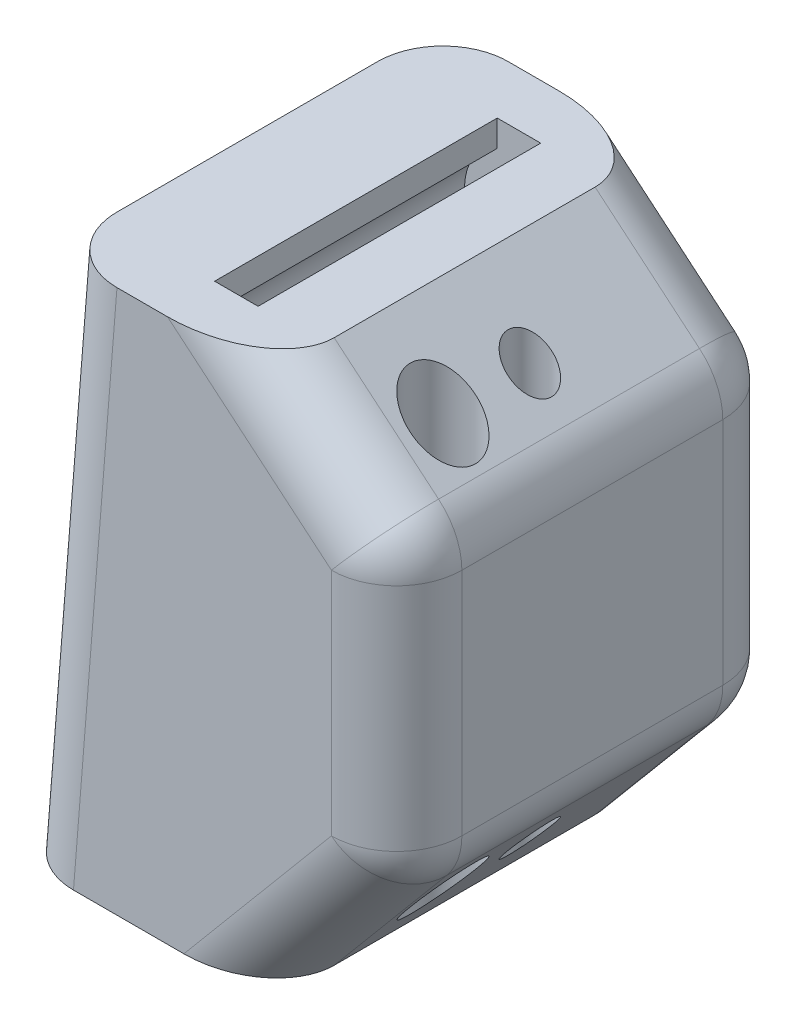
ISO-10303-21;
HEADER;
FILE_DESCRIPTION(('STEP AP214'),'2;1');
FILE_NAME('part.step','',(''),(''),'','','');
FILE_SCHEMA(('AUTOMOTIVE_DESIGN { 1 0 10303 214 1 1 1 1 }'));
ENDSEC;
DATA;
#1=APPLICATION_CONTEXT('core data for automotive mechanical design processes');
#2=APPLICATION_PROTOCOL_DEFINITION('international standard','automotive_design',2000,#1);
#3=PRODUCT_CONTEXT('',#1,'mechanical');
#4=PRODUCT('Part','Part','',(#3));
#5=PRODUCT_RELATED_PRODUCT_CATEGORY('part','',(#4));
#6=PRODUCT_DEFINITION_FORMATION('','',#4);
#7=PRODUCT_DEFINITION_CONTEXT('part definition',#1,'design');
#8=PRODUCT_DEFINITION('design','',#6,#7);
#9=PRODUCT_DEFINITION_SHAPE('','',#8);
#10=(LENGTH_UNIT() NAMED_UNIT(*) SI_UNIT(.MILLI.,.METRE.));
#11=(NAMED_UNIT(*) PLANE_ANGLE_UNIT() SI_UNIT($,.RADIAN.));
#12=(NAMED_UNIT(*) SI_UNIT($,.STERADIAN.) SOLID_ANGLE_UNIT());
#13=UNCERTAINTY_MEASURE_WITH_UNIT(LENGTH_MEASURE(1.E-05),#10,'distance_accuracy_value','');
#14=(GEOMETRIC_REPRESENTATION_CONTEXT(3) GLOBAL_UNCERTAINTY_ASSIGNED_CONTEXT((#13)) GLOBAL_UNIT_ASSIGNED_CONTEXT((#10,
#11,#12)) REPRESENTATION_CONTEXT('',''));
#15=CARTESIAN_POINT('',(0.,0.,0.));
#16=DIRECTION('',(0.,0.,1.));
#17=DIRECTION('',(1.,0.,0.));
#18=AXIS2_PLACEMENT_3D('',#15,#16,#17);
#19=CARTESIAN_POINT('',(0.,0.,18.));
#20=DIRECTION('',(0.,1.,0.));
#21=DIRECTION('',(0.,0.,1.));
#22=AXIS2_PLACEMENT_3D('',#19,#20,#21);
#23=PLANE('',#22);
#24=DIRECTION('',(1.,0.,0.));
#25=VECTOR('',#24,1.);
#26=CARTESIAN_POINT('',(0.,0.,0.));
#27=LINE('',#26,#25);
#28=CARTESIAN_POINT('',(3.00958468895627,0.,0.));
#29=VERTEX_POINT('',#28);
#30=CARTESIAN_POINT('',(8.08377813200317,0.,0.));
#31=VERTEX_POINT('',#30);
#32=EDGE_CURVE('E286',#29,#31,#27,.T.);
#33=ORIENTED_EDGE('',*,*,#32,.T.);
#34=CARTESIAN_POINT('',(8.08377813200317,0.,3.));
#35=DIRECTION('',(0.,1.,0.));
#36=DIRECTION('',(-1.,0.,0.));
#37=AXIS2_PLACEMENT_3D('',#34,#35,#36);
#38=ELLIPSE('',#37,3.91622186799683,3.);
#39=CARTESIAN_POINT('',(12.,0.,3.));
#40=VERTEX_POINT('',#39);
#41=EDGE_CURVE('E382',#31,#40,#38,.F.);
#42=ORIENTED_EDGE('',*,*,#41,.T.);
#43=DIRECTION('',(0.,0.,-1.));
#44=VECTOR('',#43,1.);
#45=CARTESIAN_POINT('',(12.,0.,18.));
#46=LINE('',#45,#44);
#47=CARTESIAN_POINT('',(12.,0.,15.));
#48=VERTEX_POINT('',#47);
#49=EDGE_CURVE('E336',#48,#40,#46,.T.);
#50=ORIENTED_EDGE('',*,*,#49,.F.);
#51=CARTESIAN_POINT('',(8.08377813200317,0.,15.));
#52=DIRECTION('',(0.,1.,0.));
#53=DIRECTION('',(1.,0.,0.));
#54=AXIS2_PLACEMENT_3D('',#51,#52,#53);
#55=ELLIPSE('',#54,3.91622186799683,3.);
#56=CARTESIAN_POINT('',(8.08377813200317,0.,18.));
#57=VERTEX_POINT('',#56);
#58=EDGE_CURVE('E379',#48,#57,#55,.F.);
#59=ORIENTED_EDGE('',*,*,#58,.T.);
#60=DIRECTION('',(1.,0.,0.));
#61=VECTOR('',#60,1.);
#62=CARTESIAN_POINT('',(0.,0.,18.));
#63=LINE('',#62,#61);
#64=CARTESIAN_POINT('',(3.00958468895627,0.,18.));
#65=VERTEX_POINT('',#64);
#66=EDGE_CURVE('E297',#65,#57,#63,.T.);
#67=ORIENTED_EDGE('',*,*,#66,.F.);
#68=CARTESIAN_POINT('',(3.00958468895627,0.,15.));
#69=DIRECTION('',(0.,1.,0.));
#70=DIRECTION('',(-1.,0.,0.));
#71=AXIS2_PLACEMENT_3D('',#68,#69,#70);
#72=ELLIPSE('',#71,3.00958468895627,3.);
#73=CARTESIAN_POINT('',(0.,0.,15.));
#74=VERTEX_POINT('',#73);
#75=EDGE_CURVE('E373',#65,#74,#72,.F.);
#76=ORIENTED_EDGE('',*,*,#75,.T.);
#77=DIRECTION('',(0.,0.,-1.));
#78=VECTOR('',#77,1.);
#79=CARTESIAN_POINT('',(0.,0.,18.));
#80=LINE('',#79,#78);
#81=CARTESIAN_POINT('',(0.,0.,3.));
#82=VERTEX_POINT('',#81);
#83=EDGE_CURVE('E340',#74,#82,#80,.T.);
#84=ORIENTED_EDGE('',*,*,#83,.T.);
#85=CARTESIAN_POINT('',(3.00958468895627,0.,3.));
#86=DIRECTION('',(0.,1.,0.));
#87=DIRECTION('',(1.,0.,0.));
#88=AXIS2_PLACEMENT_3D('',#85,#86,#87);
#89=ELLIPSE('',#88,3.00958468895627,3.);
#90=EDGE_CURVE('E376',#82,#29,#89,.F.);
#91=ORIENTED_EDGE('',*,*,#90,.T.);
#92=EDGE_LOOP('',(#33,#42,#50,#59,#67,#76,#84,#91));
#93=FACE_BOUND('',#92,.T.);
#94=DIRECTION('',(-1.,0.,0.));
#95=VECTOR('',#94,1.);
#96=CARTESIAN_POINT('',(9.,0.,15.5));
#97=LINE('',#96,#95);
#98=CARTESIAN_POINT('',(9.,0.,15.5));
#99=VERTEX_POINT('',#98);
#100=CARTESIAN_POINT('',(7.,0.,15.5));
#101=VERTEX_POINT('',#100);
#102=EDGE_CURVE('E215',#99,#101,#97,.T.);
#103=ORIENTED_EDGE('',*,*,#102,.F.);
#104=DIRECTION('',(0.,0.,-1.));
#105=VECTOR('',#104,1.);
#106=CARTESIAN_POINT('',(9.,0.,15.5));
#107=LINE('',#106,#105);
#108=CARTESIAN_POINT('',(9.,0.,2.5));
#109=VERTEX_POINT('',#108);
#110=EDGE_CURVE('E205',#99,#109,#107,.T.);
#111=ORIENTED_EDGE('',*,*,#110,.T.);
#112=DIRECTION('',(-1.,0.,0.));
#113=VECTOR('',#112,1.);
#114=CARTESIAN_POINT('',(9.,0.,2.5));
#115=LINE('',#114,#113);
#116=CARTESIAN_POINT('',(7.,0.,2.5));
#117=VERTEX_POINT('',#116);
#118=EDGE_CURVE('E224',#109,#117,#115,.T.);
#119=ORIENTED_EDGE('',*,*,#118,.T.);
#120=DIRECTION('',(0.,0.,-1.));
#121=VECTOR('',#120,1.);
#122=CARTESIAN_POINT('',(7.,0.,15.5));
#123=LINE('',#122,#121);
#124=EDGE_CURVE('E246',#101,#117,#123,.T.);
#125=ORIENTED_EDGE('',*,*,#124,.F.);
#126=EDGE_LOOP('',(#103,#111,#119,#125));
#127=FACE_BOUND('',#126,.T.);
#128=ADVANCED_FACE('F39',(#93,#127),#23,.F.);
#129=CARTESIAN_POINT('',(2.,25.,18.));
#130=DIRECTION('',(0.,-1.,0.));
#131=DIRECTION('',(0.,0.,-1.));
#132=AXIS2_PLACEMENT_3D('',#129,#130,#131);
#133=PLANE('',#132);
#134=DIRECTION('',(0.,0.,-1.));
#135=VECTOR('',#134,1.);
#136=CARTESIAN_POINT('',(12.,25.,18.));
#137=LINE('',#136,#135);
#138=CARTESIAN_POINT('',(12.,25.,15.));
#139=VERTEX_POINT('',#138);
#140=CARTESIAN_POINT('',(12.,25.,3.));
#141=VERTEX_POINT('',#140);
#142=EDGE_CURVE('E316',#139,#141,#137,.T.);
#143=ORIENTED_EDGE('',*,*,#142,.T.);
#144=CARTESIAN_POINT('',(7.33282851941877,25.,3.));
#145=DIRECTION('',(0.,-1.,0.));
#146=DIRECTION('',(1.,0.,0.));
#147=AXIS2_PLACEMENT_3D('',#144,#145,#146);
#148=ELLIPSE('',#147,4.66717148058123,3.);
#149=CARTESIAN_POINT('',(7.33282851941877,25.,0.));
#150=VERTEX_POINT('',#149);
#151=EDGE_CURVE('E406',#141,#150,#148,.F.);
#152=ORIENTED_EDGE('',*,*,#151,.T.);
#153=DIRECTION('',(-1.,0.,0.));
#154=VECTOR('',#153,1.);
#155=CARTESIAN_POINT('',(2.,25.,0.));
#156=LINE('',#155,#154);
#157=CARTESIAN_POINT('',(5.00958468895627,25.,0.));
#158=VERTEX_POINT('',#157);
#159=EDGE_CURVE('E302',#150,#158,#156,.T.);
#160=ORIENTED_EDGE('',*,*,#159,.T.);
#161=CARTESIAN_POINT('',(5.00958468895627,25.,3.));
#162=DIRECTION('',(0.,-1.,0.));
#163=DIRECTION('',(1.,0.,0.));
#164=AXIS2_PLACEMENT_3D('',#161,#162,#163);
#165=ELLIPSE('',#164,3.00958468895627,3.);
#166=CARTESIAN_POINT('',(2.,25.,3.));
#167=VERTEX_POINT('',#166);
#168=EDGE_CURVE('E400',#158,#167,#165,.F.);
#169=ORIENTED_EDGE('',*,*,#168,.T.);
#170=DIRECTION('',(0.,0.,-1.));
#171=VECTOR('',#170,1.);
#172=CARTESIAN_POINT('',(2.,25.,18.));
#173=LINE('',#172,#171);
#174=CARTESIAN_POINT('',(2.,25.,15.));
#175=VERTEX_POINT('',#174);
#176=EDGE_CURVE('E306',#175,#167,#173,.T.);
#177=ORIENTED_EDGE('',*,*,#176,.F.);
#178=CARTESIAN_POINT('',(5.00958468895627,25.,15.));
#179=DIRECTION('',(0.,-1.,0.));
#180=DIRECTION('',(-1.,0.,0.));
#181=AXIS2_PLACEMENT_3D('',#178,#179,#180);
#182=ELLIPSE('',#181,3.00958468895627,3.);
#183=CARTESIAN_POINT('',(5.00958468895627,25.,18.));
#184=VERTEX_POINT('',#183);
#185=EDGE_CURVE('E397',#175,#184,#182,.F.);
#186=ORIENTED_EDGE('',*,*,#185,.T.);
#187=DIRECTION('',(-1.,0.,0.));
#188=VECTOR('',#187,1.);
#189=CARTESIAN_POINT('',(2.,25.,18.));
#190=LINE('',#189,#188);
#191=CARTESIAN_POINT('',(7.33282851941877,25.,18.));
#192=VERTEX_POINT('',#191);
#193=EDGE_CURVE('E301',#192,#184,#190,.T.);
#194=ORIENTED_EDGE('',*,*,#193,.F.);
#195=CARTESIAN_POINT('',(7.33282851941877,25.,15.));
#196=DIRECTION('',(0.,-1.,0.));
#197=DIRECTION('',(-1.,0.,0.));
#198=AXIS2_PLACEMENT_3D('',#195,#196,#197);
#199=ELLIPSE('',#198,4.66717148058123,3.);
#200=EDGE_CURVE('E403',#192,#139,#199,.F.);
#201=ORIENTED_EDGE('',*,*,#200,.T.);
#202=EDGE_LOOP('',(#143,#152,#160,#169,#177,#186,#194,#201));
#203=FACE_BOUND('',#202,.T.);
#204=DIRECTION('',(-1.,0.,0.));
#205=VECTOR('',#204,1.);
#206=CARTESIAN_POINT('',(7.,25.,2.5));
#207=LINE('',#206,#205);
#208=CARTESIAN_POINT('',(9.,25.,2.5));
#209=VERTEX_POINT('',#208);
#210=CARTESIAN_POINT('',(7.,25.,2.5));
#211=VERTEX_POINT('',#210);
#212=EDGE_CURVE('E261',#209,#211,#207,.T.);
#213=ORIENTED_EDGE('',*,*,#212,.F.);
#214=DIRECTION('',(0.,0.,1.));
#215=VECTOR('',#214,1.);
#216=CARTESIAN_POINT('',(9.,25.,2.5));
#217=LINE('',#216,#215);
#218=CARTESIAN_POINT('',(9.,25.,15.5));
#219=VERTEX_POINT('',#218);
#220=EDGE_CURVE('E291',#209,#219,#217,.T.);
#221=ORIENTED_EDGE('',*,*,#220,.T.);
#222=DIRECTION('',(-1.,0.,0.));
#223=VECTOR('',#222,1.);
#224=CARTESIAN_POINT('',(7.,25.,15.5));
#225=LINE('',#224,#223);
#226=CARTESIAN_POINT('',(7.,25.,15.5));
#227=VERTEX_POINT('',#226);
#228=EDGE_CURVE('E276',#219,#227,#225,.T.);
#229=ORIENTED_EDGE('',*,*,#228,.T.);
#230=DIRECTION('',(0.,0.,1.));
#231=VECTOR('',#230,1.);
#232=CARTESIAN_POINT('',(7.,25.,2.5));
#233=LINE('',#232,#231);
#234=EDGE_CURVE('E287',#211,#227,#233,.T.);
#235=ORIENTED_EDGE('',*,*,#234,.F.);
#236=EDGE_LOOP('',(#213,#221,#229,#235));
#237=FACE_BOUND('',#236,.T.);
#238=ADVANCED_FACE('F474',(#203,#237),#133,.F.);
#239=CARTESIAN_POINT('',(0.,0.,18.));
#240=DIRECTION('',(0.996815278536125,-0.0797452222828899,0.));
#241=DIRECTION('',(0.0797452222828899,0.996815278536125,0.));
#242=AXIS2_PLACEMENT_3D('',#239,#240,#241);
#243=PLANE('',#242);
#244=ORIENTED_EDGE('',*,*,#176,.T.);
#245=DIRECTION('',(-0.0797452222828899,-0.996815278536125,0.));
#246=VECTOR('',#245,1.);
#247=CARTESIAN_POINT('',(0.,0.,3.));
#248=LINE('',#247,#246);
#249=EDGE_CURVE('E430',#167,#82,#248,.T.);
#250=ORIENTED_EDGE('',*,*,#249,.T.);
#251=ORIENTED_EDGE('',*,*,#83,.F.);
#252=DIRECTION('',(-0.0797452222828899,-0.996815278536125,0.));
#253=VECTOR('',#252,1.);
#254=CARTESIAN_POINT('',(0.,0.,15.));
#255=LINE('',#254,#253);
#256=EDGE_CURVE('E427',#74,#175,#255,.F.);
#257=ORIENTED_EDGE('',*,*,#256,.T.);
#258=EDGE_LOOP('',(#244,#250,#251,#257));
#259=FACE_BOUND('',#258,.T.);
#260=ADVANCED_FACE('F508',(#259),#243,.F.);
#261=CARTESIAN_POINT('',(12.,0.,18.));
#262=DIRECTION('',(-0.76604444311898,0.642787609686537,0.));
#263=DIRECTION('',(-0.642787609686537,-0.76604444311898,0.));
#264=AXIS2_PLACEMENT_3D('',#261,#262,#263);
#265=PLANE('',#264);
#266=CARTESIAN_POINT('',(15.,3.57526077778265,9.));
#267=DIRECTION('',(-0.76604444311898,0.642787609686537,0.));
#268=DIRECTION('',(-0.642787609686537,-0.76604444311898,0.));
#269=AXIS2_PLACEMENT_3D('',#266,#267,#268);
#270=ELLIPSE('',#269,1.55572382686042,1.);
#271=CARTESIAN_POINT('',(14.,2.38350718518843,9.));
#272=VERTEX_POINT('',#271);
#273=EDGE_CURVE('E227',#272,#272,#270,.F.);
#274=ORIENTED_EDGE('',*,*,#273,.F.);
#275=EDGE_LOOP('',(#274));
#276=FACE_BOUND('',#275,.T.);
#277=CARTESIAN_POINT('',(15.,3.57526077778265,13.));
#278=DIRECTION('',(-0.76604444311898,0.642787609686537,0.));
#279=DIRECTION('',(-0.642787609686537,-0.76604444311898,0.));
#280=AXIS2_PLACEMENT_3D('',#277,#278,#279);
#281=ELLIPSE('',#280,2.33358574029063,1.5);
#282=CARTESIAN_POINT('',(13.5,1.78763038889132,13.));
#283=VERTEX_POINT('',#282);
#284=EDGE_CURVE('E349',#283,#283,#281,.F.);
#285=ORIENTED_EDGE('',*,*,#284,.F.);
#286=EDGE_LOOP('',(#285));
#287=FACE_BOUND('',#286,.T.);
#288=ORIENTED_EDGE('',*,*,#49,.T.);
#289=DIRECTION('',(0.642787609686537,0.76604444311898,0.));
#290=VECTOR('',#289,1.);
#291=CARTESIAN_POINT('',(17.1718307475979,6.16354787373898,3.));
#292=LINE('',#291,#290);
#293=CARTESIAN_POINT('',(17.1718307475979,6.16354787373898,3.));
#294=VERTEX_POINT('',#293);
#295=EDGE_CURVE('E357',#40,#294,#292,.T.);
#296=ORIENTED_EDGE('',*,*,#295,.T.);
#297=DIRECTION('',(0.,0.,-1.));
#298=VECTOR('',#297,1.);
#299=CARTESIAN_POINT('',(17.1718307475979,6.16354787373898,18.));
#300=LINE('',#299,#298);
#301=CARTESIAN_POINT('',(17.1718307475979,6.16354787373898,15.));
#302=VERTEX_POINT('',#301);
#303=EDGE_CURVE('E332',#302,#294,#300,.T.);
#304=ORIENTED_EDGE('',*,*,#303,.F.);
#305=DIRECTION('',(0.642787609686537,0.76604444311898,0.));
#306=VECTOR('',#305,1.);
#307=CARTESIAN_POINT('',(12.,0.,15.));
#308=LINE('',#307,#306);
#309=EDGE_CURVE('E344',#302,#48,#308,.F.);
#310=ORIENTED_EDGE('',*,*,#309,.T.);
#311=EDGE_LOOP('',(#288,#296,#304,#310));
#312=FACE_BOUND('',#311,.T.);
#313=ADVANCED_FACE('F512',(#276,#287,#312),#265,.F.);
#314=CARTESIAN_POINT('',(14.8736974182409,8.0919107027986,18.));
#315=DIRECTION('',(0.,0.,-1.));
#316=DIRECTION('',(-1.,0.,0.));
#317=AXIS2_PLACEMENT_3D('',#314,#315,#316);
#318=CYLINDRICAL_SURFACE('',#317,3.);
#319=ORIENTED_EDGE('',*,*,#303,.T.);
#320=CARTESIAN_POINT('',(14.8736974182409,8.0919107027986,3.));
#321=DIRECTION('',(0.,0.,-1.));
#322=DIRECTION('',(-1.,0.,0.));
#323=AXIS2_PLACEMENT_3D('',#320,#321,#322);
#324=CIRCLE('',#323,3.);
#325=CARTESIAN_POINT('',(17.8736974182409,8.0919107027986,3.));
#326=VERTEX_POINT('',#325);
#327=EDGE_CURVE('E388',#294,#326,#324,.F.);
#328=ORIENTED_EDGE('',*,*,#327,.T.);
#329=DIRECTION('',(0.,0.,-1.));
#330=VECTOR('',#329,1.);
#331=CARTESIAN_POINT('',(17.8736974182409,8.0919107027986,18.));
#332=LINE('',#331,#330);
#333=CARTESIAN_POINT('',(17.8736974182409,8.0919107027986,15.));
#334=VERTEX_POINT('',#333);
#335=EDGE_CURVE('E328',#334,#326,#332,.T.);
#336=ORIENTED_EDGE('',*,*,#335,.F.);
#337=CARTESIAN_POINT('',(14.8736974182409,8.0919107027986,15.));
#338=DIRECTION('',(0.,0.,-1.));
#339=DIRECTION('',(-1.,0.,0.));
#340=AXIS2_PLACEMENT_3D('',#337,#338,#339);
#341=CIRCLE('',#340,3.);
#342=EDGE_CURVE('E385',#334,#302,#341,.T.);
#343=ORIENTED_EDGE('',*,*,#342,.T.);
#344=EDGE_LOOP('',(#319,#328,#336,#343));
#345=FACE_BOUND('',#344,.T.);
#346=ADVANCED_FACE('F764',(#345),#318,.T.);
#347=CARTESIAN_POINT('',(17.8736974182409,18.6724596882421,18.));
#348=DIRECTION('',(-1.,0.,0.));
#349=DIRECTION('',(0.,-1.,0.));
#350=AXIS2_PLACEMENT_3D('',#347,#348,#349);
#351=PLANE('',#350);
#352=ORIENTED_EDGE('',*,*,#335,.T.);
#353=DIRECTION('',(0.,1.,0.));
#354=VECTOR('',#353,1.);
#355=CARTESIAN_POINT('',(17.8736974182409,18.6724596882421,3.));
#356=LINE('',#355,#354);
#357=CARTESIAN_POINT('',(17.8736974182409,18.6724596882421,3.));
#358=VERTEX_POINT('',#357);
#359=EDGE_CURVE('E11',#326,#358,#356,.T.);
#360=ORIENTED_EDGE('',*,*,#359,.T.);
#361=DIRECTION('',(0.,0.,-1.));
#362=VECTOR('',#361,1.);
#363=CARTESIAN_POINT('',(17.8736974182409,18.6724596882421,18.));
#364=LINE('',#363,#362);
#365=CARTESIAN_POINT('',(17.8736974182409,18.6724596882421,15.));
#366=VERTEX_POINT('',#365);
#367=EDGE_CURVE('E324',#366,#358,#364,.T.);
#368=ORIENTED_EDGE('',*,*,#367,.F.);
#369=DIRECTION('',(0.,1.,0.));
#370=VECTOR('',#369,1.);
#371=CARTESIAN_POINT('',(17.8736974182409,18.6724596882421,15.));
#372=LINE('',#371,#370);
#373=EDGE_CURVE('E49',#366,#334,#372,.F.);
#374=ORIENTED_EDGE('',*,*,#373,.T.);
#375=EDGE_LOOP('',(#352,#360,#368,#374));
#376=FACE_BOUND('',#375,.T.);
#377=ADVANCED_FACE('F755',(#376),#351,.F.);
#378=CARTESIAN_POINT('',(14.8736974182409,18.6724596882421,18.));
#379=DIRECTION('',(0.,0.,-1.));
#380=DIRECTION('',(-1.,0.,0.));
#381=AXIS2_PLACEMENT_3D('',#378,#379,#380);
#382=CYLINDRICAL_SURFACE('',#381,3.);
#383=ORIENTED_EDGE('',*,*,#367,.T.);
#384=CARTESIAN_POINT('',(14.8736974182409,18.6724596882421,3.));
#385=DIRECTION('',(0.,0.,-1.));
#386=DIRECTION('',(-1.,0.,0.));
#387=AXIS2_PLACEMENT_3D('',#384,#385,#386);
#388=CIRCLE('',#387,3.);
#389=CARTESIAN_POINT('',(16.8020602473005,20.970593017599,3.));
#390=VERTEX_POINT('',#389);
#391=EDGE_CURVE('E412',#358,#390,#388,.F.);
#392=ORIENTED_EDGE('',*,*,#391,.T.);
#393=DIRECTION('',(0.,0.,-1.));
#394=VECTOR('',#393,1.);
#395=CARTESIAN_POINT('',(16.8020602473005,20.970593017599,18.));
#396=LINE('',#395,#394);
#397=CARTESIAN_POINT('',(16.8020602473005,20.970593017599,15.));
#398=VERTEX_POINT('',#397);
#399=EDGE_CURVE('E320',#398,#390,#396,.T.);
#400=ORIENTED_EDGE('',*,*,#399,.F.);
#401=CARTESIAN_POINT('',(14.8736974182409,18.6724596882421,15.));
#402=DIRECTION('',(0.,0.,-1.));
#403=DIRECTION('',(-1.,0.,0.));
#404=AXIS2_PLACEMENT_3D('',#401,#402,#403);
#405=CIRCLE('',#404,3.);
#406=EDGE_CURVE('E409',#398,#366,#405,.T.);
#407=ORIENTED_EDGE('',*,*,#406,.T.);
#408=EDGE_LOOP('',(#383,#392,#400,#407));
#409=FACE_BOUND('',#408,.T.);
#410=ADVANCED_FACE('F746',(#409),#382,.T.);
#411=CARTESIAN_POINT('',(12.,25.,18.));
#412=DIRECTION('',(-0.64278760968654,-0.766044443118977,0.));
#413=DIRECTION('',(0.766044443118977,-0.64278760968654,0.));
#414=AXIS2_PLACEMENT_3D('',#411,#412,#413);
#415=PLANE('',#414);
#416=CARTESIAN_POINT('',(15.,22.4827011064682,9.));
#417=DIRECTION('',(-0.64278760968654,-0.766044443118977,0.));
#418=DIRECTION('',(0.766044443118977,-0.64278760968654,0.));
#419=AXIS2_PLACEMENT_3D('',#416,#417,#418);
#420=ELLIPSE('',#419,1.30540728933228,1.);
#421=CARTESIAN_POINT('',(16.,21.6436014752909,9.));
#422=VERTEX_POINT('',#421);
#423=EDGE_CURVE('E351',#422,#422,#420,.F.);
#424=ORIENTED_EDGE('',*,*,#423,.F.);
#425=EDGE_LOOP('',(#424));
#426=FACE_BOUND('',#425,.T.);
#427=CARTESIAN_POINT('',(15.,22.4827011064682,13.));
#428=DIRECTION('',(-0.64278760968654,-0.766044443118977,0.));
#429=DIRECTION('',(0.766044443118977,-0.64278760968654,0.));
#430=AXIS2_PLACEMENT_3D('',#427,#428,#429);
#431=ELLIPSE('',#430,1.95811093399842,1.5);
#432=CARTESIAN_POINT('',(16.5,21.2240516597022,13.));
#433=VERTEX_POINT('',#432);
#434=EDGE_CURVE('E345',#433,#433,#431,.F.);
#435=ORIENTED_EDGE('',*,*,#434,.F.);
#436=EDGE_LOOP('',(#435));
#437=FACE_BOUND('',#436,.T.);
#438=ORIENTED_EDGE('',*,*,#399,.T.);
#439=DIRECTION('',(-0.766044443118977,0.64278760968654,0.));
#440=VECTOR('',#439,1.);
#441=CARTESIAN_POINT('',(12.,25.,3.));
#442=LINE('',#441,#440);
#443=EDGE_CURVE('E394',#390,#141,#442,.T.);
#444=ORIENTED_EDGE('',*,*,#443,.T.);
#445=ORIENTED_EDGE('',*,*,#142,.F.);
#446=DIRECTION('',(-0.766044443118977,0.64278760968654,0.));
#447=VECTOR('',#446,1.);
#448=CARTESIAN_POINT('',(12.,25.,15.));
#449=LINE('',#448,#447);
#450=EDGE_CURVE('E391',#139,#398,#449,.F.);
#451=ORIENTED_EDGE('',*,*,#450,.T.);
#452=EDGE_LOOP('',(#438,#444,#445,#451));
#453=FACE_BOUND('',#452,.T.);
#454=ADVANCED_FACE('F738',(#426,#437,#453),#415,.F.);
#455=CARTESIAN_POINT('',(14.8736974182409,18.6724596882421,18.));
#456=DIRECTION('',(0.,0.,-1.));
#457=DIRECTION('',(-1.,0.,0.));
#458=AXIS2_PLACEMENT_3D('',#455,#456,#457);
#459=PLANE('',#458);
#460=ORIENTED_EDGE('',*,*,#193,.T.);
#461=DIRECTION('',(-0.0797452222828899,-0.996815278536125,0.));
#462=VECTOR('',#461,1.);
#463=CARTESIAN_POINT('',(4.56932941920943,19.4968091281646,18.));
#464=LINE('',#463,#462);
#465=EDGE_CURVE('E423',#184,#65,#464,.T.);
#466=ORIENTED_EDGE('',*,*,#465,.T.);
#467=ORIENTED_EDGE('',*,*,#66,.T.);
#468=DIRECTION('',(0.642787609686537,0.76604444311898,0.));
#469=VECTOR('',#468,1.);
#470=CARTESIAN_POINT('',(20.083600754236,14.3008317205394,18.));
#471=LINE('',#470,#469);
#472=CARTESIAN_POINT('',(14.8736974182409,8.0919107027986,18.));
#473=VERTEX_POINT('',#472);
#474=EDGE_CURVE('E420',#57,#473,#471,.T.);
#475=ORIENTED_EDGE('',*,*,#474,.T.);
#476=DIRECTION('',(0.,1.,0.));
#477=VECTOR('',#476,1.);
#478=CARTESIAN_POINT('',(14.8736974182409,18.6724596882421,18.));
#479=LINE('',#478,#477);
#480=CARTESIAN_POINT('',(14.8736974182409,18.6724596882421,18.));
#481=VERTEX_POINT('',#480);
#482=EDGE_CURVE('E57',#473,#481,#479,.T.);
#483=ORIENTED_EDGE('',*,*,#482,.T.);
#484=DIRECTION('',(-0.766044443118977,0.64278760968654,0.));
#485=VECTOR('',#484,1.);
#486=CARTESIAN_POINT('',(14.8736974182409,18.6724596882421,18.));
#487=LINE('',#486,#485);
#488=EDGE_CURVE('E417',#481,#192,#487,.T.);
#489=ORIENTED_EDGE('',*,*,#488,.T.);
#490=EDGE_LOOP('',(#460,#466,#467,#475,#483,#489));
#491=FACE_BOUND('',#490,.T.);
#492=ADVANCED_FACE('F471',(#491),#459,.F.);
#493=CARTESIAN_POINT('',(14.8736974182409,18.6724596882421,0.));
#494=DIRECTION('',(0.,0.,-1.));
#495=DIRECTION('',(-1.,0.,0.));
#496=AXIS2_PLACEMENT_3D('',#493,#494,#495);
#497=PLANE('',#496);
#498=ORIENTED_EDGE('',*,*,#32,.F.);
#499=DIRECTION('',(-0.0797452222828899,-0.996815278536125,0.));
#500=VECTOR('',#499,1.);
#501=CARTESIAN_POINT('',(4.99044583560837,24.7607643331513,0.));
#502=LINE('',#501,#500);
#503=EDGE_CURVE('E370',#29,#158,#502,.F.);
#504=ORIENTED_EDGE('',*,*,#503,.T.);
#505=ORIENTED_EDGE('',*,*,#159,.F.);
#506=DIRECTION('',(-0.766044443118977,0.64278760968654,0.));
#507=VECTOR('',#506,1.);
#508=CARTESIAN_POINT('',(14.8736974182409,18.6724596882421,0.));
#509=LINE('',#508,#507);
#510=CARTESIAN_POINT('',(14.8736974182409,18.6724596882421,0.));
#511=VERTEX_POINT('',#510);
#512=EDGE_CURVE('E364',#150,#511,#509,.F.);
#513=ORIENTED_EDGE('',*,*,#512,.T.);
#514=DIRECTION('',(0.,1.,0.));
#515=VECTOR('',#514,1.);
#516=CARTESIAN_POINT('',(14.8736974182409,8.0919107027986,0.));
#517=LINE('',#516,#515);
#518=CARTESIAN_POINT('',(14.8736974182409,8.0919107027986,0.));
#519=VERTEX_POINT('',#518);
#520=EDGE_CURVE('E361',#511,#519,#517,.F.);
#521=ORIENTED_EDGE('',*,*,#520,.T.);
#522=DIRECTION('',(0.642787609686537,0.76604444311898,0.));
#523=VECTOR('',#522,1.);
#524=CARTESIAN_POINT('',(9.70186667064306,1.92836282905961,0.));
#525=LINE('',#524,#523);
#526=EDGE_CURVE('E367',#519,#31,#525,.F.);
#527=ORIENTED_EDGE('',*,*,#526,.T.);
#528=EDGE_LOOP('',(#498,#504,#505,#513,#521,#527));
#529=FACE_BOUND('',#528,.T.);
#530=ADVANCED_FACE('F717',(#529),#497,.T.);
#531=CARTESIAN_POINT('',(8.,21.5,2.5));
#532=DIRECTION('',(0.,0.,1.));
#533=DIRECTION('',(1.,0.,0.));
#534=AXIS2_PLACEMENT_3D('',#531,#532,#533);
#535=CYLINDRICAL_SURFACE('',#534,2.5);
#536=CARTESIAN_POINT('',(8.,21.5,15.5));
#537=DIRECTION('',(0.,0.,1.));
#538=DIRECTION('',(1.,0.,0.));
#539=AXIS2_PLACEMENT_3D('',#536,#537,#538);
#540=CIRCLE('',#539,2.5);
#541=CARTESIAN_POINT('',(7.,23.7912878474779,15.5));
#542=VERTEX_POINT('',#541);
#543=CARTESIAN_POINT('',(9.,23.7912878474779,15.5));
#544=VERTEX_POINT('',#543);
#545=EDGE_CURVE('E245',#542,#544,#540,.T.);
#546=ORIENTED_EDGE('',*,*,#545,.T.);
#547=DIRECTION('',(0.,0.,1.));
#548=VECTOR('',#547,1.);
#549=CARTESIAN_POINT('',(9.,23.7912878474779,2.5));
#550=LINE('',#549,#548);
#551=CARTESIAN_POINT('',(9.,23.7912878474779,2.5));
#552=VERTEX_POINT('',#551);
#553=EDGE_CURVE('E268',#552,#544,#550,.T.);
#554=ORIENTED_EDGE('',*,*,#553,.F.);
#555=CARTESIAN_POINT('',(8.,21.5,2.5));
#556=DIRECTION('',(0.,0.,1.));
#557=DIRECTION('',(1.,0.,0.));
#558=AXIS2_PLACEMENT_3D('',#555,#556,#557);
#559=CIRCLE('',#558,2.5);
#560=CARTESIAN_POINT('',(7.,23.7912878474779,2.5));
#561=VERTEX_POINT('',#560);
#562=EDGE_CURVE('E252',#561,#552,#559,.T.);
#563=ORIENTED_EDGE('',*,*,#562,.F.);
#564=DIRECTION('',(0.,0.,1.));
#565=VECTOR('',#564,1.);
#566=CARTESIAN_POINT('',(7.,23.7912878474779,2.5));
#567=LINE('',#566,#565);
#568=EDGE_CURVE('E283',#561,#542,#567,.T.);
#569=ORIENTED_EDGE('',*,*,#568,.T.);
#570=EDGE_LOOP('',(#546,#554,#563,#569));
#571=FACE_BOUND('',#570,.T.);
#572=ADVANCED_FACE('F708',(#571),#535,.F.);
#573=CARTESIAN_POINT('',(7.,25.,2.5));
#574=DIRECTION('',(-1.,0.,0.));
#575=DIRECTION('',(0.,-1.,0.));
#576=AXIS2_PLACEMENT_3D('',#573,#574,#575);
#577=PLANE('',#576);
#578=DIRECTION('',(0.,-1.,0.));
#579=VECTOR('',#578,1.);
#580=CARTESIAN_POINT('',(7.,25.,15.5));
#581=LINE('',#580,#579);
#582=EDGE_CURVE('E257',#227,#542,#581,.T.);
#583=ORIENTED_EDGE('',*,*,#582,.T.);
#584=ORIENTED_EDGE('',*,*,#568,.F.);
#585=DIRECTION('',(0.,-1.,0.));
#586=VECTOR('',#585,1.);
#587=CARTESIAN_POINT('',(7.,25.,2.5));
#588=LINE('',#587,#586);
#589=EDGE_CURVE('E264',#211,#561,#588,.T.);
#590=ORIENTED_EDGE('',*,*,#589,.F.);
#591=ORIENTED_EDGE('',*,*,#234,.T.);
#592=EDGE_LOOP('',(#583,#584,#590,#591));
#593=FACE_BOUND('',#592,.T.);
#594=ADVANCED_FACE('F699',(#593),#577,.F.);
#595=CARTESIAN_POINT('',(9.,25.,2.5));
#596=DIRECTION('',(1.,0.,0.));
#597=DIRECTION('',(0.,0.,-1.));
#598=AXIS2_PLACEMENT_3D('',#595,#596,#597);
#599=PLANE('',#598);
#600=DIRECTION('',(0.,1.,0.));
#601=VECTOR('',#600,1.);
#602=CARTESIAN_POINT('',(9.,25.,15.5));
#603=LINE('',#602,#601);
#604=EDGE_CURVE('E272',#544,#219,#603,.T.);
#605=ORIENTED_EDGE('',*,*,#604,.T.);
#606=ORIENTED_EDGE('',*,*,#220,.F.);
#607=DIRECTION('',(0.,1.,0.));
#608=VECTOR('',#607,1.);
#609=CARTESIAN_POINT('',(9.,25.,2.5));
#610=LINE('',#609,#608);
#611=EDGE_CURVE('E256',#552,#209,#610,.T.);
#612=ORIENTED_EDGE('',*,*,#611,.F.);
#613=ORIENTED_EDGE('',*,*,#553,.T.);
#614=EDGE_LOOP('',(#605,#606,#612,#613));
#615=FACE_BOUND('',#614,.T.);
#616=ADVANCED_FACE('F690',(#615),#599,.F.);
#617=CARTESIAN_POINT('',(8.,21.5,2.5));
#618=DIRECTION('',(0.,0.,1.));
#619=DIRECTION('',(1.,0.,0.));
#620=AXIS2_PLACEMENT_3D('',#617,#618,#619);
#621=PLANE('',#620);
#622=ORIENTED_EDGE('',*,*,#562,.T.);
#623=ORIENTED_EDGE('',*,*,#611,.T.);
#624=ORIENTED_EDGE('',*,*,#212,.T.);
#625=ORIENTED_EDGE('',*,*,#589,.T.);
#626=EDGE_LOOP('',(#622,#623,#624,#625));
#627=FACE_BOUND('',#626,.T.);
#628=ADVANCED_FACE('F681',(#627),#621,.T.);
#629=CARTESIAN_POINT('',(8.,21.5,15.5));
#630=DIRECTION('',(0.,0.,1.));
#631=DIRECTION('',(1.,0.,0.));
#632=AXIS2_PLACEMENT_3D('',#629,#630,#631);
#633=PLANE('',#632);
#634=ORIENTED_EDGE('',*,*,#545,.F.);
#635=ORIENTED_EDGE('',*,*,#582,.F.);
#636=ORIENTED_EDGE('',*,*,#228,.F.);
#637=ORIENTED_EDGE('',*,*,#604,.F.);
#638=EDGE_LOOP('',(#634,#635,#636,#637));
#639=FACE_BOUND('',#638,.T.);
#640=ADVANCED_FACE('F668',(#639),#633,.F.);
#641=CARTESIAN_POINT('',(8.,3.5,15.5));
#642=DIRECTION('',(0.,0.,-1.));
#643=DIRECTION('',(-1.,0.,0.));
#644=AXIS2_PLACEMENT_3D('',#641,#642,#643);
#645=CYLINDRICAL_SURFACE('',#644,2.5);
#646=CARTESIAN_POINT('',(8.,3.5,2.5));
#647=DIRECTION('',(0.,0.,-1.));
#648=DIRECTION('',(-1.,0.,0.));
#649=AXIS2_PLACEMENT_3D('',#646,#647,#648);
#650=CIRCLE('',#649,2.5);
#651=CARTESIAN_POINT('',(7.,1.20871215252208,2.5));
#652=VERTEX_POINT('',#651);
#653=CARTESIAN_POINT('',(9.,1.20871215252208,2.5));
#654=VERTEX_POINT('',#653);
#655=EDGE_CURVE('E200',#652,#654,#650,.T.);
#656=ORIENTED_EDGE('',*,*,#655,.T.);
#657=DIRECTION('',(0.,0.,-1.));
#658=VECTOR('',#657,1.);
#659=CARTESIAN_POINT('',(9.,1.20871215252208,15.5));
#660=LINE('',#659,#658);
#661=CARTESIAN_POINT('',(9.,1.20871215252208,15.5));
#662=VERTEX_POINT('',#661);
#663=EDGE_CURVE('E193',#662,#654,#660,.T.);
#664=ORIENTED_EDGE('',*,*,#663,.F.);
#665=CARTESIAN_POINT('',(8.,3.5,15.5));
#666=DIRECTION('',(0.,0.,-1.));
#667=DIRECTION('',(-1.,0.,0.));
#668=AXIS2_PLACEMENT_3D('',#665,#666,#667);
#669=CIRCLE('',#668,2.5);
#670=CARTESIAN_POINT('',(7.,1.20871215252208,15.5));
#671=VERTEX_POINT('',#670);
#672=EDGE_CURVE('E197',#671,#662,#669,.T.);
#673=ORIENTED_EDGE('',*,*,#672,.F.);
#674=DIRECTION('',(0.,0.,-1.));
#675=VECTOR('',#674,1.);
#676=CARTESIAN_POINT('',(7.,1.20871215252208,15.5));
#677=LINE('',#676,#675);
#678=EDGE_CURVE('E242',#671,#652,#677,.T.);
#679=ORIENTED_EDGE('',*,*,#678,.T.);
#680=EDGE_LOOP('',(#656,#664,#673,#679));
#681=FACE_BOUND('',#680,.T.);
#682=ADVANCED_FACE('F195',(#681),#645,.F.);
#683=CARTESIAN_POINT('',(7.,0.,15.5));
#684=DIRECTION('',(-1.,0.,0.));
#685=DIRECTION('',(0.,0.,1.));
#686=AXIS2_PLACEMENT_3D('',#683,#684,#685);
#687=PLANE('',#686);
#688=DIRECTION('',(0.,1.,0.));
#689=VECTOR('',#688,1.);
#690=CARTESIAN_POINT('',(7.,0.,2.5));
#691=LINE('',#690,#689);
#692=EDGE_CURVE('E220',#117,#652,#691,.T.);
#693=ORIENTED_EDGE('',*,*,#692,.T.);
#694=ORIENTED_EDGE('',*,*,#678,.F.);
#695=DIRECTION('',(0.,1.,0.));
#696=VECTOR('',#695,1.);
#697=CARTESIAN_POINT('',(7.,0.,15.5));
#698=LINE('',#697,#696);
#699=EDGE_CURVE('E206',#101,#671,#698,.T.);
#700=ORIENTED_EDGE('',*,*,#699,.F.);
#701=ORIENTED_EDGE('',*,*,#124,.T.);
#702=EDGE_LOOP('',(#693,#694,#700,#701));
#703=FACE_BOUND('',#702,.T.);
#704=ADVANCED_FACE('F652',(#703),#687,.F.);
#705=CARTESIAN_POINT('',(9.,0.,15.5));
#706=DIRECTION('',(1.,0.,0.));
#707=DIRECTION('',(0.,0.,-1.));
#708=AXIS2_PLACEMENT_3D('',#705,#706,#707);
#709=PLANE('',#708);
#710=DIRECTION('',(0.,-1.,0.));
#711=VECTOR('',#710,1.);
#712=CARTESIAN_POINT('',(9.,0.,2.5));
#713=LINE('',#712,#711);
#714=EDGE_CURVE('E236',#654,#109,#713,.T.);
#715=ORIENTED_EDGE('',*,*,#714,.T.);
#716=ORIENTED_EDGE('',*,*,#110,.F.);
#717=DIRECTION('',(0.,-1.,0.));
#718=VECTOR('',#717,1.);
#719=CARTESIAN_POINT('',(9.,0.,15.5));
#720=LINE('',#719,#718);
#721=EDGE_CURVE('E209',#662,#99,#720,.T.);
#722=ORIENTED_EDGE('',*,*,#721,.F.);
#723=ORIENTED_EDGE('',*,*,#663,.T.);
#724=EDGE_LOOP('',(#715,#716,#722,#723));
#725=FACE_BOUND('',#724,.T.);
#726=ADVANCED_FACE('F210',(#725),#709,.F.);
#727=CARTESIAN_POINT('',(8.,3.5,15.5));
#728=DIRECTION('',(0.,0.,-1.));
#729=DIRECTION('',(-1.,0.,0.));
#730=AXIS2_PLACEMENT_3D('',#727,#728,#729);
#731=PLANE('',#730);
#732=ORIENTED_EDGE('',*,*,#672,.T.);
#733=ORIENTED_EDGE('',*,*,#721,.T.);
#734=ORIENTED_EDGE('',*,*,#102,.T.);
#735=ORIENTED_EDGE('',*,*,#699,.T.);
#736=EDGE_LOOP('',(#732,#733,#734,#735));
#737=FACE_BOUND('',#736,.T.);
#738=ADVANCED_FACE('F217',(#737),#731,.T.);
#739=CARTESIAN_POINT('',(8.,3.5,2.5));
#740=DIRECTION('',(0.,0.,-1.));
#741=DIRECTION('',(-1.,0.,0.));
#742=AXIS2_PLACEMENT_3D('',#739,#740,#741);
#743=PLANE('',#742);
#744=ORIENTED_EDGE('',*,*,#655,.F.);
#745=ORIENTED_EDGE('',*,*,#692,.F.);
#746=ORIENTED_EDGE('',*,*,#118,.F.);
#747=ORIENTED_EDGE('',*,*,#714,.F.);
#748=EDGE_LOOP('',(#744,#745,#746,#747));
#749=FACE_BOUND('',#748,.T.);
#750=ADVANCED_FACE('F628',(#749),#743,.F.);
#751=CARTESIAN_POINT('',(15.,25.,13.));
#752=DIRECTION('',(0.,-1.,0.));
#753=DIRECTION('',(0.,0.,-1.));
#754=AXIS2_PLACEMENT_3D('',#751,#752,#753);
#755=CYLINDRICAL_SURFACE('',#754,1.5);
#756=ORIENTED_EDGE('',*,*,#434,.T.);
#757=EDGE_LOOP('',(#756));
#758=FACE_BOUND('',#757,.T.);
#759=ORIENTED_EDGE('',*,*,#284,.T.);
#760=EDGE_LOOP('',(#759));
#761=FACE_BOUND('',#760,.T.);
#762=ADVANCED_FACE('F619',(#758,#761),#755,.F.);
#763=CARTESIAN_POINT('',(15.,25.,9.));
#764=DIRECTION('',(0.,-1.,0.));
#765=DIRECTION('',(0.,0.,-1.));
#766=AXIS2_PLACEMENT_3D('',#763,#764,#765);
#767=CYLINDRICAL_SURFACE('',#766,1.);
#768=ORIENTED_EDGE('',*,*,#423,.T.);
#769=EDGE_LOOP('',(#768));
#770=FACE_BOUND('',#769,.T.);
#771=ORIENTED_EDGE('',*,*,#273,.T.);
#772=EDGE_LOOP('',(#771));
#773=FACE_BOUND('',#772,.T.);
#774=ADVANCED_FACE('F536',(#770,#773),#767,.F.);
#775=CARTESIAN_POINT('',(10.0716371709404,22.7018666706431,3.));
#776=DIRECTION('',(0.766044443118977,-0.64278760968654,0.));
#777=DIRECTION('',(0.64278760968654,0.766044443118977,0.));
#778=AXIS2_PLACEMENT_3D('',#775,#776,#777);
#779=CYLINDRICAL_SURFACE('',#778,3.);
#780=ORIENTED_EDGE('',*,*,#151,.F.);
#781=ORIENTED_EDGE('',*,*,#443,.F.);
#782=CARTESIAN_POINT('',(14.8736974182409,18.6724596882421,3.));
#783=DIRECTION('',(0.766044443118977,-0.642787609686541,0.));
#784=DIRECTION('',(0.642787609686541,0.766044443118977,0.));
#785=AXIS2_PLACEMENT_3D('',#782,#783,#784);
#786=CIRCLE('',#785,3.);
#787=EDGE_CURVE('E350',#511,#390,#786,.T.);
#788=ORIENTED_EDGE('',*,*,#787,.F.);
#789=ORIENTED_EDGE('',*,*,#512,.F.);
#790=EDGE_LOOP('',(#780,#781,#788,#789));
#791=FACE_BOUND('',#790,.T.);
#792=ADVANCED_FACE('F532',(#791),#779,.T.);
#793=CARTESIAN_POINT('',(14.8736974182409,18.6724596882421,3.));
#794=DIRECTION('',(0.,0.,-1.));
#795=DIRECTION('',(-1.,0.,0.));
#796=AXIS2_PLACEMENT_3D('',#793,#794,#795);
#797=SPHERICAL_SURFACE('',#796,3.);
#798=ORIENTED_EDGE('',*,*,#787,.T.);
#799=ORIENTED_EDGE('',*,*,#391,.F.);
#800=CARTESIAN_POINT('',(14.8736974182409,18.6724596882421,3.));
#801=DIRECTION('',(0.,-1.,0.));
#802=DIRECTION('',(0.,0.,-1.));
#803=AXIS2_PLACEMENT_3D('',#800,#801,#802);
#804=CIRCLE('',#803,3.);
#805=EDGE_CURVE('E443',#511,#358,#804,.T.);
#806=ORIENTED_EDGE('',*,*,#805,.F.);
#807=EDGE_LOOP('',(#798,#799,#806));
#808=FACE_BOUND('',#807,.T.);
#809=ADVANCED_FACE('F528',(#808),#797,.T.);
#810=CARTESIAN_POINT('',(14.8736974182409,18.6724596882421,3.));
#811=DIRECTION('',(0.,-1.,0.));
#812=DIRECTION('',(1.,0.,0.));
#813=AXIS2_PLACEMENT_3D('',#810,#811,#812);
#814=CYLINDRICAL_SURFACE('',#813,3.);
#815=ORIENTED_EDGE('',*,*,#805,.T.);
#816=ORIENTED_EDGE('',*,*,#359,.F.);
#817=CARTESIAN_POINT('',(14.8736974182409,8.0919107027986,3.));
#818=DIRECTION('',(0.,-1.,0.));
#819=DIRECTION('',(0.,0.,-1.));
#820=AXIS2_PLACEMENT_3D('',#817,#818,#819);
#821=CIRCLE('',#820,3.);
#822=EDGE_CURVE('E439',#519,#326,#821,.T.);
#823=ORIENTED_EDGE('',*,*,#822,.F.);
#824=ORIENTED_EDGE('',*,*,#520,.F.);
#825=EDGE_LOOP('',(#815,#816,#823,#824));
#826=FACE_BOUND('',#825,.T.);
#827=ADVANCED_FACE('F524',(#826),#814,.T.);
#828=CARTESIAN_POINT('',(14.8736974182409,8.0919107027986,3.));
#829=DIRECTION('',(0.,0.,-1.));
#830=DIRECTION('',(-1.,0.,0.));
#831=AXIS2_PLACEMENT_3D('',#828,#829,#830);
#832=SPHERICAL_SURFACE('',#831,3.);
#833=ORIENTED_EDGE('',*,*,#822,.T.);
#834=ORIENTED_EDGE('',*,*,#327,.F.);
#835=CARTESIAN_POINT('',(14.8736974182409,8.0919107027986,3.));
#836=DIRECTION('',(-0.64278760968654,-0.766044443118977,0.));
#837=DIRECTION('',(0.766044443118977,-0.64278760968654,0.));
#838=AXIS2_PLACEMENT_3D('',#835,#836,#837);
#839=CIRCLE('',#838,3.);
#840=EDGE_CURVE('E436',#519,#294,#839,.T.);
#841=ORIENTED_EDGE('',*,*,#840,.F.);
#842=EDGE_LOOP('',(#833,#834,#841));
#843=FACE_BOUND('',#842,.T.);
#844=ADVANCED_FACE('F520',(#843),#832,.T.);
#845=CARTESIAN_POINT('',(9.70186667064306,1.92836282905961,3.));
#846=DIRECTION('',(-0.642787609686537,-0.76604444311898,0.));
#847=DIRECTION('',(0.76604444311898,-0.642787609686537,0.));
#848=AXIS2_PLACEMENT_3D('',#845,#846,#847);
#849=CYLINDRICAL_SURFACE('',#848,3.);
#850=ORIENTED_EDGE('',*,*,#41,.F.);
#851=ORIENTED_EDGE('',*,*,#526,.F.);
#852=ORIENTED_EDGE('',*,*,#840,.T.);
#853=ORIENTED_EDGE('',*,*,#295,.F.);
#854=EDGE_LOOP('',(#850,#851,#852,#853));
#855=FACE_BOUND('',#854,.T.);
#856=ADVANCED_FACE('F517',(#855),#849,.T.);
#857=CARTESIAN_POINT('',(14.8736974182409,18.6724596882421,15.));
#858=DIRECTION('',(-0.766044443118977,0.64278760968654,0.));
#859=DIRECTION('',(-0.64278760968654,-0.766044443118977,0.));
#860=AXIS2_PLACEMENT_3D('',#857,#858,#859);
#861=CYLINDRICAL_SURFACE('',#860,3.);
#862=CARTESIAN_POINT('',(14.8736974182409,18.6724596882421,15.));
#863=DIRECTION('',(0.766044443118977,-0.64278760968654,0.));
#864=DIRECTION('',(0.64278760968654,0.766044443118977,0.));
#865=AXIS2_PLACEMENT_3D('',#862,#863,#864);
#866=CIRCLE('',#865,3.);
#867=EDGE_CURVE('E43',#398,#481,#866,.T.);
#868=ORIENTED_EDGE('',*,*,#867,.F.);
#869=ORIENTED_EDGE('',*,*,#450,.F.);
#870=ORIENTED_EDGE('',*,*,#200,.F.);
#871=ORIENTED_EDGE('',*,*,#488,.F.);
#872=EDGE_LOOP('',(#868,#869,#870,#871));
#873=FACE_BOUND('',#872,.T.);
#874=ADVANCED_FACE('F468',(#873),#861,.T.);
#875=CARTESIAN_POINT('',(14.8736974182409,18.6724596882421,15.));
#876=DIRECTION('',(0.,0.,-1.));
#877=DIRECTION('',(-1.,0.,0.));
#878=AXIS2_PLACEMENT_3D('',#875,#876,#877);
#879=SPHERICAL_SURFACE('',#878,3.);
#880=ORIENTED_EDGE('',*,*,#406,.F.);
#881=ORIENTED_EDGE('',*,*,#867,.T.);
#882=CARTESIAN_POINT('',(14.8736974182409,18.6724596882421,15.));
#883=DIRECTION('',(0.,-1.,0.));
#884=DIRECTION('',(0.,0.,-1.));
#885=AXIS2_PLACEMENT_3D('',#882,#883,#884);
#886=CIRCLE('',#885,3.);
#887=EDGE_CURVE('E454',#366,#481,#886,.T.);
#888=ORIENTED_EDGE('',*,*,#887,.F.);
#889=EDGE_LOOP('',(#880,#881,#888));
#890=FACE_BOUND('',#889,.T.);
#891=ADVANCED_FACE('F465',(#890),#879,.T.);
#892=CARTESIAN_POINT('',(14.8736974182409,18.6724596882421,15.));
#893=DIRECTION('',(0.,1.,0.));
#894=DIRECTION('',(-1.,0.,0.));
#895=AXIS2_PLACEMENT_3D('',#892,#893,#894);
#896=CYLINDRICAL_SURFACE('',#895,3.);
#897=CARTESIAN_POINT('',(14.8736974182409,8.0919107027986,15.));
#898=DIRECTION('',(0.,-1.,0.));
#899=DIRECTION('',(1.,0.,0.));
#900=AXIS2_PLACEMENT_3D('',#897,#898,#899);
#901=CIRCLE('',#900,3.);
#902=EDGE_CURVE('E452',#334,#473,#901,.T.);
#903=ORIENTED_EDGE('',*,*,#902,.F.);
#904=ORIENTED_EDGE('',*,*,#373,.F.);
#905=ORIENTED_EDGE('',*,*,#887,.T.);
#906=ORIENTED_EDGE('',*,*,#482,.F.);
#907=EDGE_LOOP('',(#903,#904,#905,#906));
#908=FACE_BOUND('',#907,.T.);
#909=ADVANCED_FACE('F494',(#908),#896,.T.);
#910=CARTESIAN_POINT('',(14.8736974182409,8.0919107027986,15.));
#911=DIRECTION('',(0.,0.,-1.));
#912=DIRECTION('',(-1.,0.,0.));
#913=AXIS2_PLACEMENT_3D('',#910,#911,#912);
#914=SPHERICAL_SURFACE('',#913,3.);
#915=ORIENTED_EDGE('',*,*,#342,.F.);
#916=ORIENTED_EDGE('',*,*,#902,.T.);
#917=CARTESIAN_POINT('',(14.8736974182409,8.0919107027986,15.));
#918=DIRECTION('',(-0.64278760968654,-0.766044443118977,0.));
#919=DIRECTION('',(0.766044443118977,-0.64278760968654,0.));
#920=AXIS2_PLACEMENT_3D('',#917,#918,#919);
#921=CIRCLE('',#920,3.);
#922=EDGE_CURVE('E65',#302,#473,#921,.T.);
#923=ORIENTED_EDGE('',*,*,#922,.F.);
#924=EDGE_LOOP('',(#915,#916,#923));
#925=FACE_BOUND('',#924,.T.);
#926=ADVANCED_FACE('F492',(#925),#914,.T.);
#927=CARTESIAN_POINT('',(20.083600754236,14.3008317205394,15.));
#928=DIRECTION('',(0.642787609686537,0.76604444311898,0.));
#929=DIRECTION('',(-0.76604444311898,0.642787609686537,0.));
#930=AXIS2_PLACEMENT_3D('',#927,#928,#929);
#931=CYLINDRICAL_SURFACE('',#930,3.);
#932=ORIENTED_EDGE('',*,*,#58,.F.);
#933=ORIENTED_EDGE('',*,*,#309,.F.);
#934=ORIENTED_EDGE('',*,*,#922,.T.);
#935=ORIENTED_EDGE('',*,*,#474,.F.);
#936=EDGE_LOOP('',(#932,#933,#934,#935));
#937=FACE_BOUND('',#936,.T.);
#938=ADVANCED_FACE('F487',(#937),#931,.T.);
#939=CARTESIAN_POINT('',(2.99044583560838,-0.23923566684867,3.));
#940=DIRECTION('',(0.0797452222828899,0.996815278536125,0.));
#941=DIRECTION('',(-0.996815278536125,0.0797452222828899,0.));
#942=AXIS2_PLACEMENT_3D('',#939,#940,#941);
#943=CYLINDRICAL_SURFACE('',#942,3.);
#944=ORIENTED_EDGE('',*,*,#168,.F.);
#945=ORIENTED_EDGE('',*,*,#503,.F.);
#946=ORIENTED_EDGE('',*,*,#90,.F.);
#947=ORIENTED_EDGE('',*,*,#249,.F.);
#948=EDGE_LOOP('',(#944,#945,#946,#947));
#949=FACE_BOUND('',#948,.T.);
#950=ADVANCED_FACE('F539',(#949),#943,.T.);
#951=CARTESIAN_POINT('',(4.56932941920943,19.4968091281646,15.));
#952=DIRECTION('',(-0.0797452222828899,-0.996815278536125,0.));
#953=DIRECTION('',(0.996815278536125,-0.0797452222828899,0.));
#954=AXIS2_PLACEMENT_3D('',#951,#952,#953);
#955=CYLINDRICAL_SURFACE('',#954,3.);
#956=ORIENTED_EDGE('',*,*,#185,.F.);
#957=ORIENTED_EDGE('',*,*,#256,.F.);
#958=ORIENTED_EDGE('',*,*,#75,.F.);
#959=ORIENTED_EDGE('',*,*,#465,.F.);
#960=EDGE_LOOP('',(#956,#957,#958,#959));
#961=FACE_BOUND('',#960,.T.);
#962=ADVANCED_FACE('F41',(#961),#955,.T.);
#963=CLOSED_SHELL('',(#128,#238,#260,#313,#346,#377,#410,#454,#492,#530,#572,#594,#616,#628,
#640,#682,#704,#726,#738,#750,#762,#774,#792,#809,#827,#844,#856,#874,#891,#909,#926,#938,#950,#962));
#964=MANIFOLD_SOLID_BREP('B2',#963);
#965=ADVANCED_BREP_SHAPE_REPRESENTATION('',(#18,#964),#14);
#966=SHAPE_DEFINITION_REPRESENTATION(#9,#965);
ENDSEC;
END-ISO-10303-21;
